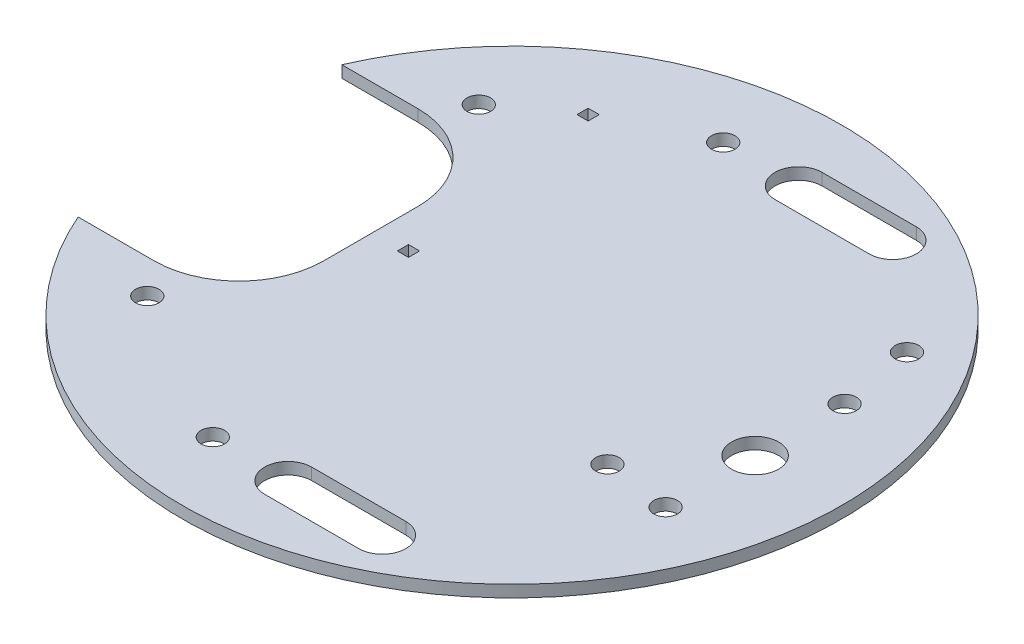
ISO-10303-21;
HEADER;
FILE_DESCRIPTION(('STEP AP214'),'2;1');
FILE_NAME('part.step','',(''),(''),'','','');
FILE_SCHEMA(('AUTOMOTIVE_DESIGN { 1 0 10303 214 1 1 1 1 }'));
ENDSEC;
DATA;
#1=APPLICATION_CONTEXT('core data for automotive mechanical design processes');
#2=APPLICATION_PROTOCOL_DEFINITION('international standard','automotive_design',2000,#1);
#3=PRODUCT_CONTEXT('',#1,'mechanical');
#4=PRODUCT('Part','Part','',(#3));
#5=PRODUCT_RELATED_PRODUCT_CATEGORY('part','',(#4));
#6=PRODUCT_DEFINITION_FORMATION('','',#4);
#7=PRODUCT_DEFINITION_CONTEXT('part definition',#1,'design');
#8=PRODUCT_DEFINITION('design','',#6,#7);
#9=PRODUCT_DEFINITION_SHAPE('','',#8);
#10=(LENGTH_UNIT() NAMED_UNIT(*) SI_UNIT(.MILLI.,.METRE.));
#11=(NAMED_UNIT(*) PLANE_ANGLE_UNIT() SI_UNIT($,.RADIAN.));
#12=(NAMED_UNIT(*) SI_UNIT($,.STERADIAN.) SOLID_ANGLE_UNIT());
#13=UNCERTAINTY_MEASURE_WITH_UNIT(LENGTH_MEASURE(1.E-05),#10,'distance_accuracy_value','');
#14=(GEOMETRIC_REPRESENTATION_CONTEXT(3) GLOBAL_UNCERTAINTY_ASSIGNED_CONTEXT((#13)) GLOBAL_UNIT_ASSIGNED_CONTEXT((#10,
#11,#12)) REPRESENTATION_CONTEXT('',''));
#15=CARTESIAN_POINT('',(0.,0.,0.));
#16=DIRECTION('',(0.,0.,1.));
#17=DIRECTION('',(1.,0.,0.));
#18=AXIS2_PLACEMENT_3D('',#15,#16,#17);
#19=CARTESIAN_POINT('',(0.,3.175,0.));
#20=DIRECTION('',(0.,-1.,0.));
#21=DIRECTION('',(0.,0.,-1.));
#22=AXIS2_PLACEMENT_3D('',#19,#20,#21);
#23=CYLINDRICAL_SURFACE('',#22,88.9);
#24=CARTESIAN_POINT('',(0.,3.175,0.));
#25=DIRECTION('',(0.,1.,0.));
#26=DIRECTION('',(0.,0.,1.));
#27=AXIS2_PLACEMENT_3D('',#24,#25,#26);
#28=CIRCLE('',#27,88.9);
#29=CARTESIAN_POINT('',(-81.4781958563148,3.175,35.56));
#30=VERTEX_POINT('',#29);
#31=CARTESIAN_POINT('',(-81.4781958563148,3.175,-35.56));
#32=VERTEX_POINT('',#31);
#33=EDGE_CURVE('E387',#30,#32,#28,.T.);
#34=ORIENTED_EDGE('',*,*,#33,.F.);
#35=DIRECTION('',(0.,-1.,0.));
#36=VECTOR('',#35,1.);
#37=CARTESIAN_POINT('',(-81.4781958563148,3.175,35.56));
#38=LINE('',#37,#36);
#39=CARTESIAN_POINT('',(-81.4781958563148,0.,35.56));
#40=VERTEX_POINT('',#39);
#41=EDGE_CURVE('E383',#30,#40,#38,.T.);
#42=ORIENTED_EDGE('',*,*,#41,.T.);
#43=CARTESIAN_POINT('',(0.,0.,0.));
#44=DIRECTION('',(0.,1.,0.));
#45=DIRECTION('',(0.,0.,1.));
#46=AXIS2_PLACEMENT_3D('',#43,#44,#45);
#47=CIRCLE('',#46,88.9);
#48=CARTESIAN_POINT('',(-81.4781958563148,0.,-35.56));
#49=VERTEX_POINT('',#48);
#50=EDGE_CURVE('E386',#40,#49,#47,.T.);
#51=ORIENTED_EDGE('',*,*,#50,.T.);
#52=DIRECTION('',(0.,-1.,0.));
#53=VECTOR('',#52,1.);
#54=CARTESIAN_POINT('',(-81.4781958563148,3.175,-35.56));
#55=LINE('',#54,#53);
#56=EDGE_CURVE('E378',#49,#32,#55,.F.);
#57=ORIENTED_EDGE('',*,*,#56,.T.);
#58=EDGE_LOOP('',(#34,#42,#51,#57));
#59=FACE_BOUND('',#58,.T.);
#60=ADVANCED_FACE('F34',(#59),#23,.T.);
#61=CARTESIAN_POINT('',(0.,3.175,0.));
#62=DIRECTION('',(0.,1.,0.));
#63=DIRECTION('',(0.,0.,1.));
#64=AXIS2_PLACEMENT_3D('',#61,#62,#63);
#65=PLANE('',#64);
#66=DIRECTION('',(1.,0.,0.));
#67=VECTOR('',#66,1.);
#68=CARTESIAN_POINT('',(0.,3.175,-62.4827214621127));
#69=LINE('',#68,#67);
#70=CARTESIAN_POINT('',(8.44233372588642,3.175,-62.4827214621127));
#71=VERTEX_POINT('',#70);
#72=CARTESIAN_POINT('',(33.8423337258864,3.175,-62.4827214621127));
#73=VERTEX_POINT('',#72);
#74=EDGE_CURVE('E49',#71,#73,#69,.T.);
#75=ORIENTED_EDGE('',*,*,#74,.F.);
#76=CARTESIAN_POINT('',(8.44233372588642,3.175,-68.8327214621127));
#77=DIRECTION('',(0.,1.,0.));
#78=DIRECTION('',(0.,0.,1.));
#79=AXIS2_PLACEMENT_3D('',#76,#77,#78);
#80=CIRCLE('',#79,6.34999999999999);
#81=CARTESIAN_POINT('',(8.44233372588642,3.175,-75.1827214621127));
#82=VERTEX_POINT('',#81);
#83=EDGE_CURVE('E203',#82,#71,#80,.T.);
#84=ORIENTED_EDGE('',*,*,#83,.F.);
#85=DIRECTION('',(1.,0.,0.));
#86=VECTOR('',#85,1.);
#87=CARTESIAN_POINT('',(0.,3.175,-75.1827214621127));
#88=LINE('',#87,#86);
#89=CARTESIAN_POINT('',(33.8423337258864,3.175,-75.1827214621127));
#90=VERTEX_POINT('',#89);
#91=EDGE_CURVE('E206',#82,#90,#88,.T.);
#92=ORIENTED_EDGE('',*,*,#91,.T.);
#93=CARTESIAN_POINT('',(33.8423337258864,3.175,-68.8327214621127));
#94=DIRECTION('',(0.,1.,0.));
#95=DIRECTION('',(0.,0.,1.));
#96=AXIS2_PLACEMENT_3D('',#93,#94,#95);
#97=CIRCLE('',#96,6.34999999999999);
#98=EDGE_CURVE('E212',#73,#90,#97,.T.);
#99=ORIENTED_EDGE('',*,*,#98,.F.);
#100=EDGE_LOOP('',(#75,#84,#92,#99));
#101=FACE_BOUND('',#100,.T.);
#102=CARTESIAN_POINT('',(65.5497185348647,3.175,0.));
#103=DIRECTION('',(0.,1.,0.));
#104=DIRECTION('',(0.,0.,1.));
#105=AXIS2_PLACEMENT_3D('',#102,#103,#104);
#106=CIRCLE('',#105,6.35);
#107=CARTESIAN_POINT('',(65.5497185348647,3.175,6.35));
#108=VERTEX_POINT('',#107);
#109=EDGE_CURVE('E225',#108,#108,#106,.T.);
#110=ORIENTED_EDGE('',*,*,#109,.F.);
#111=EDGE_LOOP('',(#110));
#112=FACE_BOUND('',#111,.T.);
#113=DIRECTION('',(1.,0.,0.));
#114=VECTOR('',#113,1.);
#115=CARTESIAN_POINT('',(0.,3.175,75.1827214621126));
#116=LINE('',#115,#114);
#117=CARTESIAN_POINT('',(8.44233372588644,3.175,75.1827214621126));
#118=VERTEX_POINT('',#117);
#119=CARTESIAN_POINT('',(33.8423337258864,3.175,75.1827214621126));
#120=VERTEX_POINT('',#119);
#121=EDGE_CURVE('E57',#118,#120,#116,.T.);
#122=ORIENTED_EDGE('',*,*,#121,.F.);
#123=CARTESIAN_POINT('',(8.44233372588644,3.175,68.8327214621126));
#124=DIRECTION('',(0.,1.,0.));
#125=DIRECTION('',(0.,0.,1.));
#126=AXIS2_PLACEMENT_3D('',#123,#124,#125);
#127=CIRCLE('',#126,6.34999999999999);
#128=CARTESIAN_POINT('',(8.44233372588644,3.175,62.4827214621126));
#129=VERTEX_POINT('',#128);
#130=EDGE_CURVE('E233',#129,#118,#127,.T.);
#131=ORIENTED_EDGE('',*,*,#130,.F.);
#132=DIRECTION('',(1.,0.,0.));
#133=VECTOR('',#132,1.);
#134=CARTESIAN_POINT('',(0.,3.175,62.4827214621126));
#135=LINE('',#134,#133);
#136=CARTESIAN_POINT('',(33.8423337258864,3.175,62.4827214621126));
#137=VERTEX_POINT('',#136);
#138=EDGE_CURVE('E247',#129,#137,#135,.T.);
#139=ORIENTED_EDGE('',*,*,#138,.T.);
#140=CARTESIAN_POINT('',(33.8423337258864,3.175,68.8327214621126));
#141=DIRECTION('',(0.,1.,0.));
#142=DIRECTION('',(0.,0.,1.));
#143=AXIS2_PLACEMENT_3D('',#140,#141,#142);
#144=CIRCLE('',#143,6.34999999999999);
#145=EDGE_CURVE('E244',#120,#137,#144,.T.);
#146=ORIENTED_EDGE('',*,*,#145,.F.);
#147=EDGE_LOOP('',(#122,#131,#139,#146));
#148=FACE_BOUND('',#147,.T.);
#149=DIRECTION('',(0.,0.,1.));
#150=VECTOR('',#149,1.);
#151=CARTESIAN_POINT('',(-38.1,3.175,0.));
#152=LINE('',#151,#150);
#153=CARTESIAN_POINT('',(-38.1,3.175,-58.62));
#154=VERTEX_POINT('',#153);
#155=CARTESIAN_POINT('',(-38.1,3.175,-55.62));
#156=VERTEX_POINT('',#155);
#157=EDGE_CURVE('E271',#154,#156,#152,.T.);
#158=ORIENTED_EDGE('',*,*,#157,.F.);
#159=DIRECTION('',(1.,0.,0.));
#160=VECTOR('',#159,1.);
#161=CARTESIAN_POINT('',(0.,3.175,-58.62));
#162=LINE('',#161,#160);
#163=CARTESIAN_POINT('',(-35.1,3.175,-58.62));
#164=VERTEX_POINT('',#163);
#165=EDGE_CURVE('E262',#154,#164,#162,.T.);
#166=ORIENTED_EDGE('',*,*,#165,.T.);
#167=DIRECTION('',(0.,0.,1.));
#168=VECTOR('',#167,1.);
#169=CARTESIAN_POINT('',(-35.0999999999999,3.175,0.));
#170=LINE('',#169,#168);
#171=CARTESIAN_POINT('',(-35.1,3.175,-55.62));
#172=VERTEX_POINT('',#171);
#173=EDGE_CURVE('E277',#164,#172,#170,.T.);
#174=ORIENTED_EDGE('',*,*,#173,.T.);
#175=DIRECTION('',(1.,0.,0.));
#176=VECTOR('',#175,1.);
#177=CARTESIAN_POINT('',(0.,3.175,-55.62));
#178=LINE('',#177,#176);
#179=EDGE_CURVE('E273',#156,#172,#178,.T.);
#180=ORIENTED_EDGE('',*,*,#179,.F.);
#181=EDGE_LOOP('',(#158,#166,#174,#180));
#182=FACE_BOUND('',#181,.T.);
#183=DIRECTION('',(0.,0.,1.));
#184=VECTOR('',#183,1.);
#185=CARTESIAN_POINT('',(-30.48,3.175,0.));
#186=LINE('',#185,#184);
#187=CARTESIAN_POINT('',(-30.48,3.175,-2.54000000000001));
#188=VERTEX_POINT('',#187);
#189=CARTESIAN_POINT('',(-30.48,3.175,0.459999999999989));
#190=VERTEX_POINT('',#189);
#191=EDGE_CURVE('E274',#188,#190,#186,.T.);
#192=ORIENTED_EDGE('',*,*,#191,.F.);
#193=DIRECTION('',(1.,0.,0.));
#194=VECTOR('',#193,1.);
#195=CARTESIAN_POINT('',(0.,3.175,-2.54000000000001));
#196=LINE('',#195,#194);
#197=CARTESIAN_POINT('',(-27.48,3.175,-2.54000000000001));
#198=VERTEX_POINT('',#197);
#199=EDGE_CURVE('E302',#188,#198,#196,.T.);
#200=ORIENTED_EDGE('',*,*,#199,.T.);
#201=DIRECTION('',(0.,0.,1.));
#202=VECTOR('',#201,1.);
#203=CARTESIAN_POINT('',(-27.48,3.175,0.));
#204=LINE('',#203,#202);
#205=CARTESIAN_POINT('',(-27.48,3.175,0.459999999999989));
#206=VERTEX_POINT('',#205);
#207=EDGE_CURVE('E305',#198,#206,#204,.T.);
#208=ORIENTED_EDGE('',*,*,#207,.T.);
#209=DIRECTION('',(1.,0.,0.));
#210=VECTOR('',#209,1.);
#211=CARTESIAN_POINT('',(0.,3.175,0.459999999999989));
#212=LINE('',#211,#210);
#213=EDGE_CURVE('E309',#190,#206,#212,.T.);
#214=ORIENTED_EDGE('',*,*,#213,.F.);
#215=EDGE_LOOP('',(#192,#200,#208,#214));
#216=FACE_BOUND('',#215,.T.);
#217=CARTESIAN_POINT('',(61.9,3.175,-44.62));
#218=DIRECTION('',(0.,1.,0.));
#219=DIRECTION('',(0.,0.,1.));
#220=AXIS2_PLACEMENT_3D('',#217,#218,#219);
#221=CIRCLE('',#220,3.175);
#222=CARTESIAN_POINT('',(61.9,3.175,-41.445));
#223=VERTEX_POINT('',#222);
#224=EDGE_CURVE('E301',#223,#223,#221,.T.);
#225=ORIENTED_EDGE('',*,*,#224,.F.);
#226=EDGE_LOOP('',(#225));
#227=FACE_BOUND('',#226,.T.);
#228=CARTESIAN_POINT('',(47.695,3.175,21.96));
#229=DIRECTION('',(0.,1.,0.));
#230=DIRECTION('',(0.,0.,1.));
#231=AXIS2_PLACEMENT_3D('',#228,#229,#230);
#232=CIRCLE('',#231,3.175);
#233=CARTESIAN_POINT('',(47.695,3.175,25.135));
#234=VERTEX_POINT('',#233);
#235=EDGE_CURVE('E327',#234,#234,#232,.T.);
#236=ORIENTED_EDGE('',*,*,#235,.F.);
#237=EDGE_LOOP('',(#236));
#238=FACE_BOUND('',#237,.T.);
#239=DIRECTION('',(1.,0.,0.));
#240=VECTOR('',#239,1.);
#241=CARTESIAN_POINT('',(-88.9,3.175,35.56));
#242=LINE('',#241,#240);
#243=CARTESIAN_POINT('',(-60.96,3.175,35.56));
#244=VERTEX_POINT('',#243);
#245=EDGE_CURVE('E364',#30,#244,#242,.T.);
#246=ORIENTED_EDGE('',*,*,#245,.F.);
#247=ORIENTED_EDGE('',*,*,#33,.T.);
#248=DIRECTION('',(-1.,0.,0.));
#249=VECTOR('',#248,1.);
#250=CARTESIAN_POINT('',(-38.1,3.175,-35.56));
#251=LINE('',#250,#249);
#252=CARTESIAN_POINT('',(-60.96,3.175,-35.56));
#253=VERTEX_POINT('',#252);
#254=EDGE_CURVE('E367',#253,#32,#251,.T.);
#255=ORIENTED_EDGE('',*,*,#254,.F.);
#256=CARTESIAN_POINT('',(-60.96,3.175,-12.7));
#257=DIRECTION('',(0.,1.,0.));
#258=DIRECTION('',(0.,0.,1.));
#259=AXIS2_PLACEMENT_3D('',#256,#257,#258);
#260=CIRCLE('',#259,22.86);
#261=CARTESIAN_POINT('',(-38.1,3.175,-12.7));
#262=VERTEX_POINT('',#261);
#263=EDGE_CURVE('E42',#253,#262,#260,.F.);
#264=ORIENTED_EDGE('',*,*,#263,.T.);
#265=DIRECTION('',(0.,0.,-1.));
#266=VECTOR('',#265,1.);
#267=CARTESIAN_POINT('',(-38.1,3.175,35.56));
#268=LINE('',#267,#266);
#269=CARTESIAN_POINT('',(-38.1,3.175,12.7));
#270=VERTEX_POINT('',#269);
#271=EDGE_CURVE('E363',#270,#262,#268,.T.);
#272=ORIENTED_EDGE('',*,*,#271,.F.);
#273=CARTESIAN_POINT('',(-60.96,3.175,12.7));
#274=DIRECTION('',(0.,1.,0.));
#275=DIRECTION('',(0.,0.,1.));
#276=AXIS2_PLACEMENT_3D('',#273,#274,#275);
#277=CIRCLE('',#276,22.86);
#278=EDGE_CURVE('E405',#270,#244,#277,.F.);
#279=ORIENTED_EDGE('',*,*,#278,.T.);
#280=EDGE_LOOP('',(#246,#247,#255,#264,#272,#279));
#281=FACE_BOUND('',#280,.T.);
#282=CARTESIAN_POINT('',(-53.672052260751,3.175,44.7027214621126));
#283=DIRECTION('',(0.,1.,0.));
#284=DIRECTION('',(0.,0.,1.));
#285=AXIS2_PLACEMENT_3D('',#282,#283,#284);
#286=CIRCLE('',#285,3.175);
#287=CARTESIAN_POINT('',(-53.672052260751,3.175,47.8777214621126));
#288=VERTEX_POINT('',#287);
#289=EDGE_CURVE('E357',#288,#288,#286,.T.);
#290=ORIENTED_EDGE('',*,*,#289,.F.);
#291=EDGE_LOOP('',(#290));
#292=FACE_BOUND('',#291,.T.);
#293=CARTESIAN_POINT('',(-11.8776662741139,3.175,68.8327214621126));
#294=DIRECTION('',(0.,1.,0.));
#295=DIRECTION('',(0.,0.,1.));
#296=AXIS2_PLACEMENT_3D('',#293,#294,#295);
#297=CIRCLE('',#296,3.17499999999999);
#298=CARTESIAN_POINT('',(-11.8776662741139,3.175,72.0077214621126));
#299=VERTEX_POINT('',#298);
#300=EDGE_CURVE('E351',#299,#299,#297,.T.);
#301=ORIENTED_EDGE('',*,*,#300,.F.);
#302=EDGE_LOOP('',(#301));
#303=FACE_BOUND('',#302,.T.);
#304=CARTESIAN_POINT('',(65.5497185348648,3.175,24.13));
#305=DIRECTION('',(0.,1.,0.));
#306=DIRECTION('',(0.,0.,1.));
#307=AXIS2_PLACEMENT_3D('',#304,#305,#306);
#308=CIRCLE('',#307,3.175);
#309=CARTESIAN_POINT('',(65.5497185348648,3.175,27.305));
#310=VERTEX_POINT('',#309);
#311=EDGE_CURVE('E345',#310,#310,#308,.T.);
#312=ORIENTED_EDGE('',*,*,#311,.F.);
#313=EDGE_LOOP('',(#312));
#314=FACE_BOUND('',#313,.T.);
#315=CARTESIAN_POINT('',(65.5497185348648,3.175,-24.13));
#316=DIRECTION('',(0.,1.,0.));
#317=DIRECTION('',(0.,0.,1.));
#318=AXIS2_PLACEMENT_3D('',#315,#316,#317);
#319=CIRCLE('',#318,3.175);
#320=CARTESIAN_POINT('',(65.5497185348648,3.175,-20.955));
#321=VERTEX_POINT('',#320);
#322=EDGE_CURVE('E339',#321,#321,#319,.T.);
#323=ORIENTED_EDGE('',*,*,#322,.F.);
#324=EDGE_LOOP('',(#323));
#325=FACE_BOUND('',#324,.T.);
#326=CARTESIAN_POINT('',(-11.877666274114,3.175,-68.8327214621127));
#327=DIRECTION('',(0.,1.,0.));
#328=DIRECTION('',(0.,0.,1.));
#329=AXIS2_PLACEMENT_3D('',#326,#327,#328);
#330=CIRCLE('',#329,3.175);
#331=CARTESIAN_POINT('',(-11.877666274114,3.175,-65.6577214621127));
#332=VERTEX_POINT('',#331);
#333=EDGE_CURVE('E332',#332,#332,#330,.T.);
#334=ORIENTED_EDGE('',*,*,#333,.F.);
#335=EDGE_LOOP('',(#334));
#336=FACE_BOUND('',#335,.T.);
#337=CARTESIAN_POINT('',(-53.672052260751,3.175,-44.7027214621127));
#338=DIRECTION('',(0.,1.,0.));
#339=DIRECTION('',(0.,0.,1.));
#340=AXIS2_PLACEMENT_3D('',#337,#338,#339);
#341=CIRCLE('',#340,3.17499999999999);
#342=CARTESIAN_POINT('',(-53.672052260751,3.175,-41.5277214621127));
#343=VERTEX_POINT('',#342);
#344=EDGE_CURVE('E335',#343,#343,#341,.T.);
#345=ORIENTED_EDGE('',*,*,#344,.F.);
#346=EDGE_LOOP('',(#345));
#347=FACE_BOUND('',#346,.T.);
#348=ADVANCED_FACE('F412',(#101,#112,#148,#182,#216,#227,#238,#281,#292,#303,#314,#325,#336,
#347),#65,.T.);
#349=CARTESIAN_POINT('',(0.,0.,0.));
#350=DIRECTION('',(0.,1.,0.));
#351=DIRECTION('',(0.,0.,1.));
#352=AXIS2_PLACEMENT_3D('',#349,#350,#351);
#353=PLANE('',#352);
#354=CARTESIAN_POINT('',(8.44233372588642,0.,-68.8327214621127));
#355=DIRECTION('',(0.,1.,0.));
#356=DIRECTION('',(0.,0.,1.));
#357=AXIS2_PLACEMENT_3D('',#354,#355,#356);
#358=CIRCLE('',#357,6.34999999999999);
#359=CARTESIAN_POINT('',(8.44233372588642,0.,-75.1827214621127));
#360=VERTEX_POINT('',#359);
#361=CARTESIAN_POINT('',(8.44233372588642,0.,-62.4827214621127));
#362=VERTEX_POINT('',#361);
#363=EDGE_CURVE('E190',#360,#362,#358,.T.);
#364=ORIENTED_EDGE('',*,*,#363,.T.);
#365=DIRECTION('',(1.,0.,0.));
#366=VECTOR('',#365,1.);
#367=CARTESIAN_POINT('',(0.,0.,-62.4827214621127));
#368=LINE('',#367,#366);
#369=CARTESIAN_POINT('',(33.8423337258864,0.,-62.4827214621127));
#370=VERTEX_POINT('',#369);
#371=EDGE_CURVE('E184',#362,#370,#368,.T.);
#372=ORIENTED_EDGE('',*,*,#371,.T.);
#373=CARTESIAN_POINT('',(33.8423337258864,0.,-68.8327214621127));
#374=DIRECTION('',(0.,1.,0.));
#375=DIRECTION('',(0.,0.,1.));
#376=AXIS2_PLACEMENT_3D('',#373,#374,#375);
#377=CIRCLE('',#376,6.34999999999999);
#378=CARTESIAN_POINT('',(33.8423337258864,0.,-75.1827214621127));
#379=VERTEX_POINT('',#378);
#380=EDGE_CURVE('E193',#370,#379,#377,.T.);
#381=ORIENTED_EDGE('',*,*,#380,.T.);
#382=DIRECTION('',(1.,0.,0.));
#383=VECTOR('',#382,1.);
#384=CARTESIAN_POINT('',(0.,0.,-75.1827214621127));
#385=LINE('',#384,#383);
#386=EDGE_CURVE('E198',#360,#379,#385,.T.);
#387=ORIENTED_EDGE('',*,*,#386,.F.);
#388=EDGE_LOOP('',(#364,#372,#381,#387));
#389=FACE_BOUND('',#388,.T.);
#390=CARTESIAN_POINT('',(65.5497185348647,0.,0.));
#391=DIRECTION('',(0.,1.,0.));
#392=DIRECTION('',(0.,0.,1.));
#393=AXIS2_PLACEMENT_3D('',#390,#391,#392);
#394=CIRCLE('',#393,6.35);
#395=CARTESIAN_POINT('',(65.5497185348647,0.,6.35));
#396=VERTEX_POINT('',#395);
#397=EDGE_CURVE('E213',#396,#396,#394,.T.);
#398=ORIENTED_EDGE('',*,*,#397,.T.);
#399=EDGE_LOOP('',(#398));
#400=FACE_BOUND('',#399,.T.);
#401=CARTESIAN_POINT('',(8.44233372588644,0.,68.8327214621126));
#402=DIRECTION('',(0.,1.,0.));
#403=DIRECTION('',(0.,0.,1.));
#404=AXIS2_PLACEMENT_3D('',#401,#402,#403);
#405=CIRCLE('',#404,6.34999999999999);
#406=CARTESIAN_POINT('',(8.44233372588644,0.,62.4827214621126));
#407=VERTEX_POINT('',#406);
#408=CARTESIAN_POINT('',(8.44233372588644,0.,75.1827214621126));
#409=VERTEX_POINT('',#408);
#410=EDGE_CURVE('E239',#407,#409,#405,.T.);
#411=ORIENTED_EDGE('',*,*,#410,.T.);
#412=DIRECTION('',(1.,0.,0.));
#413=VECTOR('',#412,1.);
#414=CARTESIAN_POINT('',(0.,0.,75.1827214621126));
#415=LINE('',#414,#413);
#416=CARTESIAN_POINT('',(33.8423337258864,0.,75.1827214621126));
#417=VERTEX_POINT('',#416);
#418=EDGE_CURVE('E229',#409,#417,#415,.T.);
#419=ORIENTED_EDGE('',*,*,#418,.T.);
#420=CARTESIAN_POINT('',(33.8423337258864,0.,68.8327214621126));
#421=DIRECTION('',(0.,1.,0.));
#422=DIRECTION('',(0.,0.,1.));
#423=AXIS2_PLACEMENT_3D('',#420,#421,#422);
#424=CIRCLE('',#423,6.34999999999999);
#425=CARTESIAN_POINT('',(33.8423337258864,0.,62.4827214621126));
#426=VERTEX_POINT('',#425);
#427=EDGE_CURVE('E232',#417,#426,#424,.T.);
#428=ORIENTED_EDGE('',*,*,#427,.T.);
#429=DIRECTION('',(1.,0.,0.));
#430=VECTOR('',#429,1.);
#431=CARTESIAN_POINT('',(0.,0.,62.4827214621126));
#432=LINE('',#431,#430);
#433=EDGE_CURVE('E236',#407,#426,#432,.T.);
#434=ORIENTED_EDGE('',*,*,#433,.F.);
#435=EDGE_LOOP('',(#411,#419,#428,#434));
#436=FACE_BOUND('',#435,.T.);
#437=DIRECTION('',(1.,0.,0.));
#438=VECTOR('',#437,1.);
#439=CARTESIAN_POINT('',(0.,0.,-58.62));
#440=LINE('',#439,#438);
#441=CARTESIAN_POINT('',(-38.1,0.,-58.62));
#442=VERTEX_POINT('',#441);
#443=CARTESIAN_POINT('',(-35.1,0.,-58.62));
#444=VERTEX_POINT('',#443);
#445=EDGE_CURVE('E268',#442,#444,#440,.T.);
#446=ORIENTED_EDGE('',*,*,#445,.F.);
#447=DIRECTION('',(0.,0.,1.));
#448=VECTOR('',#447,1.);
#449=CARTESIAN_POINT('',(-38.1,0.,0.));
#450=LINE('',#449,#448);
#451=CARTESIAN_POINT('',(-38.1,0.,-55.62));
#452=VERTEX_POINT('',#451);
#453=EDGE_CURVE('E258',#442,#452,#450,.T.);
#454=ORIENTED_EDGE('',*,*,#453,.T.);
#455=DIRECTION('',(1.,0.,0.));
#456=VECTOR('',#455,1.);
#457=CARTESIAN_POINT('',(0.,0.,-55.62));
#458=LINE('',#457,#456);
#459=CARTESIAN_POINT('',(-35.1,0.,-55.62));
#460=VERTEX_POINT('',#459);
#461=EDGE_CURVE('E261',#452,#460,#458,.T.);
#462=ORIENTED_EDGE('',*,*,#461,.T.);
#463=DIRECTION('',(0.,0.,1.));
#464=VECTOR('',#463,1.);
#465=CARTESIAN_POINT('',(-35.0999999999999,0.,0.));
#466=LINE('',#465,#464);
#467=EDGE_CURVE('E265',#444,#460,#466,.T.);
#468=ORIENTED_EDGE('',*,*,#467,.F.);
#469=EDGE_LOOP('',(#446,#454,#462,#468));
#470=FACE_BOUND('',#469,.T.);
#471=DIRECTION('',(1.,0.,0.));
#472=VECTOR('',#471,1.);
#473=CARTESIAN_POINT('',(0.,0.,-2.54000000000001));
#474=LINE('',#473,#472);
#475=CARTESIAN_POINT('',(-30.48,0.,-2.54000000000001));
#476=VERTEX_POINT('',#475);
#477=CARTESIAN_POINT('',(-27.48,0.,-2.54000000000001));
#478=VERTEX_POINT('',#477);
#479=EDGE_CURVE('E294',#476,#478,#474,.T.);
#480=ORIENTED_EDGE('',*,*,#479,.F.);
#481=DIRECTION('',(0.,0.,1.));
#482=VECTOR('',#481,1.);
#483=CARTESIAN_POINT('',(-30.48,0.,0.));
#484=LINE('',#483,#482);
#485=CARTESIAN_POINT('',(-30.48,0.,0.459999999999989));
#486=VERTEX_POINT('',#485);
#487=EDGE_CURVE('E306',#476,#486,#484,.T.);
#488=ORIENTED_EDGE('',*,*,#487,.T.);
#489=DIRECTION('',(1.,0.,0.));
#490=VECTOR('',#489,1.);
#491=CARTESIAN_POINT('',(0.,0.,0.459999999999989));
#492=LINE('',#491,#490);
#493=CARTESIAN_POINT('',(-27.48,0.,0.459999999999989));
#494=VERTEX_POINT('',#493);
#495=EDGE_CURVE('E317',#486,#494,#492,.T.);
#496=ORIENTED_EDGE('',*,*,#495,.T.);
#497=DIRECTION('',(0.,0.,1.));
#498=VECTOR('',#497,1.);
#499=CARTESIAN_POINT('',(-27.48,0.,0.));
#500=LINE('',#499,#498);
#501=EDGE_CURVE('E314',#478,#494,#500,.T.);
#502=ORIENTED_EDGE('',*,*,#501,.F.);
#503=EDGE_LOOP('',(#480,#488,#496,#502));
#504=FACE_BOUND('',#503,.T.);
#505=CARTESIAN_POINT('',(61.9,0.,-44.62));
#506=DIRECTION('',(0.,1.,0.));
#507=DIRECTION('',(0.,0.,1.));
#508=AXIS2_PLACEMENT_3D('',#505,#506,#507);
#509=CIRCLE('',#508,3.175);
#510=CARTESIAN_POINT('',(61.9,0.,-41.445));
#511=VERTEX_POINT('',#510);
#512=EDGE_CURVE('E324',#511,#511,#509,.T.);
#513=ORIENTED_EDGE('',*,*,#512,.T.);
#514=EDGE_LOOP('',(#513));
#515=FACE_BOUND('',#514,.T.);
#516=CARTESIAN_POINT('',(47.695,0.,21.96));
#517=DIRECTION('',(0.,1.,0.));
#518=DIRECTION('',(0.,0.,1.));
#519=AXIS2_PLACEMENT_3D('',#516,#517,#518);
#520=CIRCLE('',#519,3.175);
#521=CARTESIAN_POINT('',(47.695,0.,25.135));
#522=VERTEX_POINT('',#521);
#523=EDGE_CURVE('E219',#522,#522,#520,.T.);
#524=ORIENTED_EDGE('',*,*,#523,.T.);
#525=EDGE_LOOP('',(#524));
#526=FACE_BOUND('',#525,.T.);
#527=CARTESIAN_POINT('',(-53.672052260751,0.,44.7027214621126));
#528=DIRECTION('',(0.,1.,0.));
#529=DIRECTION('',(0.,0.,1.));
#530=AXIS2_PLACEMENT_3D('',#527,#528,#529);
#531=CIRCLE('',#530,3.175);
#532=CARTESIAN_POINT('',(-53.672052260751,0.,47.8777214621126));
#533=VERTEX_POINT('',#532);
#534=EDGE_CURVE('E360',#533,#533,#531,.T.);
#535=ORIENTED_EDGE('',*,*,#534,.T.);
#536=EDGE_LOOP('',(#535));
#537=FACE_BOUND('',#536,.T.);
#538=CARTESIAN_POINT('',(-11.8776662741139,0.,68.8327214621126));
#539=DIRECTION('',(0.,1.,0.));
#540=DIRECTION('',(0.,0.,1.));
#541=AXIS2_PLACEMENT_3D('',#538,#539,#540);
#542=CIRCLE('',#541,3.17499999999999);
#543=CARTESIAN_POINT('',(-11.8776662741139,0.,72.0077214621126));
#544=VERTEX_POINT('',#543);
#545=EDGE_CURVE('E354',#544,#544,#542,.T.);
#546=ORIENTED_EDGE('',*,*,#545,.T.);
#547=EDGE_LOOP('',(#546));
#548=FACE_BOUND('',#547,.T.);
#549=CARTESIAN_POINT('',(65.5497185348648,0.,24.13));
#550=DIRECTION('',(0.,1.,0.));
#551=DIRECTION('',(0.,0.,1.));
#552=AXIS2_PLACEMENT_3D('',#549,#550,#551);
#553=CIRCLE('',#552,3.175);
#554=CARTESIAN_POINT('',(65.5497185348648,0.,27.305));
#555=VERTEX_POINT('',#554);
#556=EDGE_CURVE('E348',#555,#555,#553,.T.);
#557=ORIENTED_EDGE('',*,*,#556,.T.);
#558=EDGE_LOOP('',(#557));
#559=FACE_BOUND('',#558,.T.);
#560=CARTESIAN_POINT('',(65.5497185348648,0.,-24.13));
#561=DIRECTION('',(0.,1.,0.));
#562=DIRECTION('',(0.,0.,1.));
#563=AXIS2_PLACEMENT_3D('',#560,#561,#562);
#564=CIRCLE('',#563,3.175);
#565=CARTESIAN_POINT('',(65.5497185348648,0.,-20.955));
#566=VERTEX_POINT('',#565);
#567=EDGE_CURVE('E342',#566,#566,#564,.T.);
#568=ORIENTED_EDGE('',*,*,#567,.T.);
#569=EDGE_LOOP('',(#568));
#570=FACE_BOUND('',#569,.T.);
#571=CARTESIAN_POINT('',(-11.877666274114,0.,-68.8327214621127));
#572=DIRECTION('',(0.,1.,0.));
#573=DIRECTION('',(0.,0.,1.));
#574=AXIS2_PLACEMENT_3D('',#571,#572,#573);
#575=CIRCLE('',#574,3.175);
#576=CARTESIAN_POINT('',(-11.877666274114,0.,-65.6577214621127));
#577=VERTEX_POINT('',#576);
#578=EDGE_CURVE('E336',#577,#577,#575,.T.);
#579=ORIENTED_EDGE('',*,*,#578,.T.);
#580=EDGE_LOOP('',(#579));
#581=FACE_BOUND('',#580,.T.);
#582=CARTESIAN_POINT('',(-53.672052260751,0.,-44.7027214621127));
#583=DIRECTION('',(0.,1.,0.));
#584=DIRECTION('',(0.,0.,1.));
#585=AXIS2_PLACEMENT_3D('',#582,#583,#584);
#586=CIRCLE('',#585,3.17499999999999);
#587=CARTESIAN_POINT('',(-53.672052260751,0.,-41.5277214621127));
#588=VERTEX_POINT('',#587);
#589=EDGE_CURVE('E375',#588,#588,#586,.T.);
#590=ORIENTED_EDGE('',*,*,#589,.T.);
#591=EDGE_LOOP('',(#590));
#592=FACE_BOUND('',#591,.T.);
#593=ORIENTED_EDGE('',*,*,#50,.F.);
#594=DIRECTION('',(1.,0.,0.));
#595=VECTOR('',#594,1.);
#596=CARTESIAN_POINT('',(0.,0.,35.56));
#597=LINE('',#596,#595);
#598=CARTESIAN_POINT('',(-60.96,0.,35.56));
#599=VERTEX_POINT('',#598);
#600=EDGE_CURVE('E390',#40,#599,#597,.T.);
#601=ORIENTED_EDGE('',*,*,#600,.T.);
#602=CARTESIAN_POINT('',(-60.96,0.,12.7));
#603=DIRECTION('',(0.,1.,0.));
#604=DIRECTION('',(0.,0.,1.));
#605=AXIS2_PLACEMENT_3D('',#602,#603,#604);
#606=CIRCLE('',#605,22.86);
#607=CARTESIAN_POINT('',(-38.1,0.,12.7));
#608=VERTEX_POINT('',#607);
#609=EDGE_CURVE('E407',#599,#608,#606,.T.);
#610=ORIENTED_EDGE('',*,*,#609,.T.);
#611=DIRECTION('',(0.,0.,-1.));
#612=VECTOR('',#611,1.);
#613=CARTESIAN_POINT('',(-38.1,0.,35.56));
#614=LINE('',#613,#612);
#615=CARTESIAN_POINT('',(-38.1,0.,-12.7));
#616=VERTEX_POINT('',#615);
#617=EDGE_CURVE('E368',#608,#616,#614,.T.);
#618=ORIENTED_EDGE('',*,*,#617,.T.);
#619=CARTESIAN_POINT('',(-60.96,0.,-12.7));
#620=DIRECTION('',(0.,1.,0.));
#621=DIRECTION('',(0.,0.,1.));
#622=AXIS2_PLACEMENT_3D('',#619,#620,#621);
#623=CIRCLE('',#622,22.86);
#624=CARTESIAN_POINT('',(-60.96,0.,-35.56));
#625=VERTEX_POINT('',#624);
#626=EDGE_CURVE('E12',#616,#625,#623,.T.);
#627=ORIENTED_EDGE('',*,*,#626,.T.);
#628=DIRECTION('',(-1.,0.,0.));
#629=VECTOR('',#628,1.);
#630=CARTESIAN_POINT('',(-38.1,0.,-35.56));
#631=LINE('',#630,#629);
#632=EDGE_CURVE('E284',#625,#49,#631,.T.);
#633=ORIENTED_EDGE('',*,*,#632,.T.);
#634=EDGE_LOOP('',(#593,#601,#610,#618,#627,#633));
#635=FACE_BOUND('',#634,.T.);
#636=ADVANCED_FACE('F200',(#389,#400,#436,#470,#504,#515,#526,#537,#548,#559,#570,#581,#592,
#635),#353,.F.);
#637=CARTESIAN_POINT('',(-53.672052260751,0.,-44.7027214621127));
#638=DIRECTION('',(0.,1.,0.));
#639=DIRECTION('',(0.,0.,1.));
#640=AXIS2_PLACEMENT_3D('',#637,#638,#639);
#641=CYLINDRICAL_SURFACE('',#640,3.17499999999999);
#642=ORIENTED_EDGE('',*,*,#589,.F.);
#643=EDGE_LOOP('',(#642));
#644=FACE_BOUND('',#643,.T.);
#645=ORIENTED_EDGE('',*,*,#344,.T.);
#646=EDGE_LOOP('',(#645));
#647=FACE_BOUND('',#646,.T.);
#648=ADVANCED_FACE('F506',(#644,#647),#641,.F.);
#649=CARTESIAN_POINT('',(-11.877666274114,0.,-68.8327214621127));
#650=DIRECTION('',(0.,1.,0.));
#651=DIRECTION('',(0.,0.,1.));
#652=AXIS2_PLACEMENT_3D('',#649,#650,#651);
#653=CYLINDRICAL_SURFACE('',#652,3.175);
#654=ORIENTED_EDGE('',*,*,#578,.F.);
#655=EDGE_LOOP('',(#654));
#656=FACE_BOUND('',#655,.T.);
#657=ORIENTED_EDGE('',*,*,#333,.T.);
#658=EDGE_LOOP('',(#657));
#659=FACE_BOUND('',#658,.T.);
#660=ADVANCED_FACE('F502',(#656,#659),#653,.F.);
#661=CARTESIAN_POINT('',(65.5497185348648,0.,-24.13));
#662=DIRECTION('',(0.,1.,0.));
#663=DIRECTION('',(0.,0.,1.));
#664=AXIS2_PLACEMENT_3D('',#661,#662,#663);
#665=CYLINDRICAL_SURFACE('',#664,3.175);
#666=ORIENTED_EDGE('',*,*,#567,.F.);
#667=EDGE_LOOP('',(#666));
#668=FACE_BOUND('',#667,.T.);
#669=ORIENTED_EDGE('',*,*,#322,.T.);
#670=EDGE_LOOP('',(#669));
#671=FACE_BOUND('',#670,.T.);
#672=ADVANCED_FACE('F505',(#668,#671),#665,.F.);
#673=CARTESIAN_POINT('',(65.5497185348648,0.,24.13));
#674=DIRECTION('',(0.,1.,0.));
#675=DIRECTION('',(0.,0.,1.));
#676=AXIS2_PLACEMENT_3D('',#673,#674,#675);
#677=CYLINDRICAL_SURFACE('',#676,3.175);
#678=ORIENTED_EDGE('',*,*,#556,.F.);
#679=EDGE_LOOP('',(#678));
#680=FACE_BOUND('',#679,.T.);
#681=ORIENTED_EDGE('',*,*,#311,.T.);
#682=EDGE_LOOP('',(#681));
#683=FACE_BOUND('',#682,.T.);
#684=ADVANCED_FACE('F510',(#680,#683),#677,.F.);
#685=CARTESIAN_POINT('',(-11.8776662741139,0.,68.8327214621126));
#686=DIRECTION('',(0.,1.,0.));
#687=DIRECTION('',(0.,0.,1.));
#688=AXIS2_PLACEMENT_3D('',#685,#686,#687);
#689=CYLINDRICAL_SURFACE('',#688,3.17499999999999);
#690=ORIENTED_EDGE('',*,*,#545,.F.);
#691=EDGE_LOOP('',(#690));
#692=FACE_BOUND('',#691,.T.);
#693=ORIENTED_EDGE('',*,*,#300,.T.);
#694=EDGE_LOOP('',(#693));
#695=FACE_BOUND('',#694,.T.);
#696=ADVANCED_FACE('F444',(#692,#695),#689,.F.);
#697=CARTESIAN_POINT('',(-53.672052260751,0.,44.7027214621126));
#698=DIRECTION('',(0.,1.,0.));
#699=DIRECTION('',(0.,0.,1.));
#700=AXIS2_PLACEMENT_3D('',#697,#698,#699);
#701=CYLINDRICAL_SURFACE('',#700,3.175);
#702=ORIENTED_EDGE('',*,*,#534,.F.);
#703=EDGE_LOOP('',(#702));
#704=FACE_BOUND('',#703,.T.);
#705=ORIENTED_EDGE('',*,*,#289,.T.);
#706=EDGE_LOOP('',(#705));
#707=FACE_BOUND('',#706,.T.);
#708=ADVANCED_FACE('F437',(#704,#707),#701,.F.);
#709=CARTESIAN_POINT('',(-88.9,0.,35.56));
#710=DIRECTION('',(0.,0.,1.));
#711=DIRECTION('',(1.,0.,0.));
#712=AXIS2_PLACEMENT_3D('',#709,#710,#711);
#713=PLANE('',#712);
#714=ORIENTED_EDGE('',*,*,#245,.T.);
#715=DIRECTION('',(0.,1.,0.));
#716=VECTOR('',#715,1.);
#717=CARTESIAN_POINT('',(-60.96,0.,35.56));
#718=LINE('',#717,#716);
#719=EDGE_CURVE('E400',#244,#599,#718,.F.);
#720=ORIENTED_EDGE('',*,*,#719,.T.);
#721=ORIENTED_EDGE('',*,*,#600,.F.);
#722=ORIENTED_EDGE('',*,*,#41,.F.);
#723=EDGE_LOOP('',(#714,#720,#721,#722));
#724=FACE_BOUND('',#723,.T.);
#725=ADVANCED_FACE('F435',(#724),#713,.F.);
#726=CARTESIAN_POINT('',(-38.1,0.,-35.56));
#727=DIRECTION('',(0.,0.,-1.));
#728=DIRECTION('',(-1.,0.,0.));
#729=AXIS2_PLACEMENT_3D('',#726,#727,#728);
#730=PLANE('',#729);
#731=ORIENTED_EDGE('',*,*,#632,.F.);
#732=DIRECTION('',(0.,1.,0.));
#733=VECTOR('',#732,1.);
#734=CARTESIAN_POINT('',(-60.96,3.175,-35.56));
#735=LINE('',#734,#733);
#736=EDGE_CURVE('E402',#625,#253,#735,.T.);
#737=ORIENTED_EDGE('',*,*,#736,.T.);
#738=ORIENTED_EDGE('',*,*,#254,.T.);
#739=ORIENTED_EDGE('',*,*,#56,.F.);
#740=EDGE_LOOP('',(#731,#737,#738,#739));
#741=FACE_BOUND('',#740,.T.);
#742=ADVANCED_FACE('F427',(#741),#730,.F.);
#743=CARTESIAN_POINT('',(-38.1,0.,35.56));
#744=DIRECTION('',(1.,0.,0.));
#745=DIRECTION('',(0.,0.,-1.));
#746=AXIS2_PLACEMENT_3D('',#743,#744,#745);
#747=PLANE('',#746);
#748=ORIENTED_EDGE('',*,*,#617,.F.);
#749=DIRECTION('',(0.,1.,0.));
#750=VECTOR('',#749,1.);
#751=CARTESIAN_POINT('',(-38.1,3.175,12.7));
#752=LINE('',#751,#750);
#753=EDGE_CURVE('E397',#608,#270,#752,.T.);
#754=ORIENTED_EDGE('',*,*,#753,.T.);
#755=ORIENTED_EDGE('',*,*,#271,.T.);
#756=DIRECTION('',(0.,1.,0.));
#757=VECTOR('',#756,1.);
#758=CARTESIAN_POINT('',(-38.1,0.,-12.7));
#759=LINE('',#758,#757);
#760=EDGE_CURVE('E395',#262,#616,#759,.F.);
#761=ORIENTED_EDGE('',*,*,#760,.T.);
#762=EDGE_LOOP('',(#748,#754,#755,#761));
#763=FACE_BOUND('',#762,.T.);
#764=ADVANCED_FACE('F419',(#763),#747,.F.);
#765=CARTESIAN_POINT('',(47.695,0.,21.96));
#766=DIRECTION('',(0.,1.,0.));
#767=DIRECTION('',(0.,0.,1.));
#768=AXIS2_PLACEMENT_3D('',#765,#766,#767);
#769=CYLINDRICAL_SURFACE('',#768,3.175);
#770=ORIENTED_EDGE('',*,*,#523,.F.);
#771=EDGE_LOOP('',(#770));
#772=FACE_BOUND('',#771,.T.);
#773=ORIENTED_EDGE('',*,*,#235,.T.);
#774=EDGE_LOOP('',(#773));
#775=FACE_BOUND('',#774,.T.);
#776=ADVANCED_FACE('F497',(#772,#775),#769,.F.);
#777=CARTESIAN_POINT('',(61.9,0.,-44.62));
#778=DIRECTION('',(0.,1.,0.));
#779=DIRECTION('',(0.,0.,1.));
#780=AXIS2_PLACEMENT_3D('',#777,#778,#779);
#781=CYLINDRICAL_SURFACE('',#780,3.175);
#782=ORIENTED_EDGE('',*,*,#512,.F.);
#783=EDGE_LOOP('',(#782));
#784=FACE_BOUND('',#783,.T.);
#785=ORIENTED_EDGE('',*,*,#224,.T.);
#786=EDGE_LOOP('',(#785));
#787=FACE_BOUND('',#786,.T.);
#788=ADVANCED_FACE('F483',(#784,#787),#781,.F.);
#789=CARTESIAN_POINT('',(-30.48,0.,0.));
#790=DIRECTION('',(-1.,0.,0.));
#791=DIRECTION('',(0.,0.,1.));
#792=AXIS2_PLACEMENT_3D('',#789,#790,#791);
#793=PLANE('',#792);
#794=ORIENTED_EDGE('',*,*,#191,.T.);
#795=DIRECTION('',(0.,1.,0.));
#796=VECTOR('',#795,1.);
#797=CARTESIAN_POINT('',(-30.48,0.,0.459999999999989));
#798=LINE('',#797,#796);
#799=EDGE_CURVE('E291',#486,#190,#798,.T.);
#800=ORIENTED_EDGE('',*,*,#799,.F.);
#801=ORIENTED_EDGE('',*,*,#487,.F.);
#802=DIRECTION('',(0.,1.,0.));
#803=VECTOR('',#802,1.);
#804=CARTESIAN_POINT('',(-30.48,0.,-2.54000000000001));
#805=LINE('',#804,#803);
#806=EDGE_CURVE('E299',#476,#188,#805,.T.);
#807=ORIENTED_EDGE('',*,*,#806,.T.);
#808=EDGE_LOOP('',(#794,#800,#801,#807));
#809=FACE_BOUND('',#808,.T.);
#810=ADVANCED_FACE('F479',(#809),#793,.F.);
#811=CARTESIAN_POINT('',(0.,0.,-2.54000000000001));
#812=DIRECTION('',(0.,0.,1.));
#813=DIRECTION('',(1.,0.,0.));
#814=AXIS2_PLACEMENT_3D('',#811,#812,#813);
#815=PLANE('',#814);
#816=ORIENTED_EDGE('',*,*,#199,.F.);
#817=ORIENTED_EDGE('',*,*,#806,.F.);
#818=ORIENTED_EDGE('',*,*,#479,.T.);
#819=DIRECTION('',(0.,1.,0.));
#820=VECTOR('',#819,1.);
#821=CARTESIAN_POINT('',(-27.48,0.,-2.54000000000001));
#822=LINE('',#821,#820);
#823=EDGE_CURVE('E297',#478,#198,#822,.T.);
#824=ORIENTED_EDGE('',*,*,#823,.T.);
#825=EDGE_LOOP('',(#816,#817,#818,#824));
#826=FACE_BOUND('',#825,.T.);
#827=ADVANCED_FACE('F482',(#826),#815,.T.);
#828=CARTESIAN_POINT('',(-27.48,0.,0.));
#829=DIRECTION('',(-1.,0.,0.));
#830=DIRECTION('',(0.,0.,1.));
#831=AXIS2_PLACEMENT_3D('',#828,#829,#830);
#832=PLANE('',#831);
#833=ORIENTED_EDGE('',*,*,#207,.F.);
#834=ORIENTED_EDGE('',*,*,#823,.F.);
#835=ORIENTED_EDGE('',*,*,#501,.T.);
#836=DIRECTION('',(0.,1.,0.));
#837=VECTOR('',#836,1.);
#838=CARTESIAN_POINT('',(-27.48,0.,0.459999999999989));
#839=LINE('',#838,#837);
#840=EDGE_CURVE('E295',#494,#206,#839,.T.);
#841=ORIENTED_EDGE('',*,*,#840,.T.);
#842=EDGE_LOOP('',(#833,#834,#835,#841));
#843=FACE_BOUND('',#842,.T.);
#844=ADVANCED_FACE('F487',(#843),#832,.T.);
#845=CARTESIAN_POINT('',(0.,0.,0.459999999999989));
#846=DIRECTION('',(0.,0.,1.));
#847=DIRECTION('',(1.,0.,0.));
#848=AXIS2_PLACEMENT_3D('',#845,#846,#847);
#849=PLANE('',#848);
#850=ORIENTED_EDGE('',*,*,#213,.T.);
#851=ORIENTED_EDGE('',*,*,#840,.F.);
#852=ORIENTED_EDGE('',*,*,#495,.F.);
#853=ORIENTED_EDGE('',*,*,#799,.T.);
#854=EDGE_LOOP('',(#850,#851,#852,#853));
#855=FACE_BOUND('',#854,.T.);
#856=ADVANCED_FACE('F477',(#855),#849,.F.);
#857=CARTESIAN_POINT('',(-38.1,0.,0.));
#858=DIRECTION('',(-1.,0.,0.));
#859=DIRECTION('',(0.,0.,1.));
#860=AXIS2_PLACEMENT_3D('',#857,#858,#859);
#861=PLANE('',#860);
#862=ORIENTED_EDGE('',*,*,#157,.T.);
#863=DIRECTION('',(0.,1.,0.));
#864=VECTOR('',#863,1.);
#865=CARTESIAN_POINT('',(-38.1,0.,-55.62));
#866=LINE('',#865,#864);
#867=EDGE_CURVE('E270',#452,#156,#866,.T.);
#868=ORIENTED_EDGE('',*,*,#867,.F.);
#869=ORIENTED_EDGE('',*,*,#453,.F.);
#870=DIRECTION('',(0.,1.,0.));
#871=VECTOR('',#870,1.);
#872=CARTESIAN_POINT('',(-38.1,0.,-58.62));
#873=LINE('',#872,#871);
#874=EDGE_CURVE('E282',#442,#154,#873,.T.);
#875=ORIENTED_EDGE('',*,*,#874,.T.);
#876=EDGE_LOOP('',(#862,#868,#869,#875));
#877=FACE_BOUND('',#876,.T.);
#878=ADVANCED_FACE('F474',(#877),#861,.F.);
#879=CARTESIAN_POINT('',(0.,0.,-58.62));
#880=DIRECTION('',(0.,0.,1.));
#881=DIRECTION('',(1.,0.,0.));
#882=AXIS2_PLACEMENT_3D('',#879,#880,#881);
#883=PLANE('',#882);
#884=ORIENTED_EDGE('',*,*,#165,.F.);
#885=ORIENTED_EDGE('',*,*,#874,.F.);
#886=ORIENTED_EDGE('',*,*,#445,.T.);
#887=DIRECTION('',(0.,1.,0.));
#888=VECTOR('',#887,1.);
#889=CARTESIAN_POINT('',(-35.1,0.,-58.62));
#890=LINE('',#889,#888);
#891=EDGE_CURVE('E285',#444,#164,#890,.T.);
#892=ORIENTED_EDGE('',*,*,#891,.T.);
#893=EDGE_LOOP('',(#884,#885,#886,#892));
#894=FACE_BOUND('',#893,.T.);
#895=ADVANCED_FACE('F469',(#894),#883,.T.);
#896=CARTESIAN_POINT('',(-35.0999999999999,0.,0.));
#897=DIRECTION('',(-1.,0.,0.));
#898=DIRECTION('',(0.,0.,1.));
#899=AXIS2_PLACEMENT_3D('',#896,#897,#898);
#900=PLANE('',#899);
#901=ORIENTED_EDGE('',*,*,#173,.F.);
#902=ORIENTED_EDGE('',*,*,#891,.F.);
#903=ORIENTED_EDGE('',*,*,#467,.T.);
#904=DIRECTION('',(0.,1.,0.));
#905=VECTOR('',#904,1.);
#906=CARTESIAN_POINT('',(-35.1,0.,-55.62));
#907=LINE('',#906,#905);
#908=EDGE_CURVE('E287',#460,#172,#907,.T.);
#909=ORIENTED_EDGE('',*,*,#908,.T.);
#910=EDGE_LOOP('',(#901,#902,#903,#909));
#911=FACE_BOUND('',#910,.T.);
#912=ADVANCED_FACE('F463',(#911),#900,.T.);
#913=CARTESIAN_POINT('',(0.,0.,-55.62));
#914=DIRECTION('',(0.,0.,1.));
#915=DIRECTION('',(1.,0.,0.));
#916=AXIS2_PLACEMENT_3D('',#913,#914,#915);
#917=PLANE('',#916);
#918=ORIENTED_EDGE('',*,*,#179,.T.);
#919=ORIENTED_EDGE('',*,*,#908,.F.);
#920=ORIENTED_EDGE('',*,*,#461,.F.);
#921=ORIENTED_EDGE('',*,*,#867,.T.);
#922=EDGE_LOOP('',(#918,#919,#920,#921));
#923=FACE_BOUND('',#922,.T.);
#924=ADVANCED_FACE('F457',(#923),#917,.F.);
#925=CARTESIAN_POINT('',(-60.96,0.,12.7));
#926=DIRECTION('',(0.,-1.,0.));
#927=DIRECTION('',(0.,0.,-1.));
#928=AXIS2_PLACEMENT_3D('',#925,#926,#927);
#929=CYLINDRICAL_SURFACE('',#928,22.86);
#930=ORIENTED_EDGE('',*,*,#609,.F.);
#931=ORIENTED_EDGE('',*,*,#719,.F.);
#932=ORIENTED_EDGE('',*,*,#278,.F.);
#933=ORIENTED_EDGE('',*,*,#753,.F.);
#934=EDGE_LOOP('',(#930,#931,#932,#933));
#935=FACE_BOUND('',#934,.T.);
#936=ADVANCED_FACE('F434',(#935),#929,.F.);
#937=CARTESIAN_POINT('',(-60.96,0.,-12.7));
#938=DIRECTION('',(0.,-1.,0.));
#939=DIRECTION('',(0.,0.,-1.));
#940=AXIS2_PLACEMENT_3D('',#937,#938,#939);
#941=CYLINDRICAL_SURFACE('',#940,22.86);
#942=ORIENTED_EDGE('',*,*,#626,.F.);
#943=ORIENTED_EDGE('',*,*,#760,.F.);
#944=ORIENTED_EDGE('',*,*,#263,.F.);
#945=ORIENTED_EDGE('',*,*,#736,.F.);
#946=EDGE_LOOP('',(#942,#943,#944,#945));
#947=FACE_BOUND('',#946,.T.);
#948=ADVANCED_FACE('F36',(#947),#941,.F.);
#949=CARTESIAN_POINT('',(0.,0.,75.1827214621126));
#950=DIRECTION('',(0.,0.,1.));
#951=DIRECTION('',(1.,0.,0.));
#952=AXIS2_PLACEMENT_3D('',#949,#950,#951);
#953=PLANE('',#952);
#954=ORIENTED_EDGE('',*,*,#121,.T.);
#955=DIRECTION('',(0.,1.,0.));
#956=VECTOR('',#955,1.);
#957=CARTESIAN_POINT('',(33.8423337258864,0.,75.1827214621126));
#958=LINE('',#957,#956);
#959=EDGE_CURVE('E242',#417,#120,#958,.T.);
#960=ORIENTED_EDGE('',*,*,#959,.F.);
#961=ORIENTED_EDGE('',*,*,#418,.F.);
#962=DIRECTION('',(0.,1.,0.));
#963=VECTOR('',#962,1.);
#964=CARTESIAN_POINT('',(8.44233372588644,0.,75.1827214621126));
#965=LINE('',#964,#963);
#966=EDGE_CURVE('E228',#409,#118,#965,.T.);
#967=ORIENTED_EDGE('',*,*,#966,.T.);
#968=EDGE_LOOP('',(#954,#960,#961,#967));
#969=FACE_BOUND('',#968,.T.);
#970=ADVANCED_FACE('F462',(#969),#953,.F.);
#971=CARTESIAN_POINT('',(8.44233372588644,0.,68.8327214621126));
#972=DIRECTION('',(0.,1.,0.));
#973=DIRECTION('',(0.,0.,1.));
#974=AXIS2_PLACEMENT_3D('',#971,#972,#973);
#975=CYLINDRICAL_SURFACE('',#974,6.34999999999999);
#976=ORIENTED_EDGE('',*,*,#130,.T.);
#977=ORIENTED_EDGE('',*,*,#966,.F.);
#978=ORIENTED_EDGE('',*,*,#410,.F.);
#979=DIRECTION('',(0.,1.,0.));
#980=VECTOR('',#979,1.);
#981=CARTESIAN_POINT('',(8.44233372588644,0.,62.4827214621126));
#982=LINE('',#981,#980);
#983=EDGE_CURVE('E253',#407,#129,#982,.T.);
#984=ORIENTED_EDGE('',*,*,#983,.T.);
#985=EDGE_LOOP('',(#976,#977,#978,#984));
#986=FACE_BOUND('',#985,.T.);
#987=ADVANCED_FACE('F670',(#986),#975,.F.);
#988=CARTESIAN_POINT('',(0.,0.,62.4827214621126));
#989=DIRECTION('',(0.,0.,1.));
#990=DIRECTION('',(1.,0.,0.));
#991=AXIS2_PLACEMENT_3D('',#988,#989,#990);
#992=PLANE('',#991);
#993=ORIENTED_EDGE('',*,*,#138,.F.);
#994=ORIENTED_EDGE('',*,*,#983,.F.);
#995=ORIENTED_EDGE('',*,*,#433,.T.);
#996=DIRECTION('',(0.,1.,0.));
#997=VECTOR('',#996,1.);
#998=CARTESIAN_POINT('',(33.8423337258864,0.,62.4827214621126));
#999=LINE('',#998,#997);
#1000=EDGE_CURVE('E255',#426,#137,#999,.T.);
#1001=ORIENTED_EDGE('',*,*,#1000,.T.);
#1002=EDGE_LOOP('',(#993,#994,#995,#1001));
#1003=FACE_BOUND('',#1002,.T.);
#1004=ADVANCED_FACE('F676',(#1003),#992,.T.);
#1005=CARTESIAN_POINT('',(33.8423337258864,0.,68.8327214621126));
#1006=DIRECTION('',(0.,1.,0.));
#1007=DIRECTION('',(0.,0.,1.));
#1008=AXIS2_PLACEMENT_3D('',#1005,#1006,#1007);
#1009=CYLINDRICAL_SURFACE('',#1008,6.34999999999999);
#1010=ORIENTED_EDGE('',*,*,#145,.T.);
#1011=ORIENTED_EDGE('',*,*,#1000,.F.);
#1012=ORIENTED_EDGE('',*,*,#427,.F.);
#1013=ORIENTED_EDGE('',*,*,#959,.T.);
#1014=EDGE_LOOP('',(#1010,#1011,#1012,#1013));
#1015=FACE_BOUND('',#1014,.T.);
#1016=ADVANCED_FACE('F684',(#1015),#1009,.F.);
#1017=CARTESIAN_POINT('',(65.5497185348647,0.,0.));
#1018=DIRECTION('',(0.,1.,0.));
#1019=DIRECTION('',(0.,0.,1.));
#1020=AXIS2_PLACEMENT_3D('',#1017,#1018,#1019);
#1021=CYLINDRICAL_SURFACE('',#1020,6.35);
#1022=ORIENTED_EDGE('',*,*,#397,.F.);
#1023=EDGE_LOOP('',(#1022));
#1024=FACE_BOUND('',#1023,.T.);
#1025=ORIENTED_EDGE('',*,*,#109,.T.);
#1026=EDGE_LOOP('',(#1025));
#1027=FACE_BOUND('',#1026,.T.);
#1028=ADVANCED_FACE('F692',(#1024,#1027),#1021,.F.);
#1029=CARTESIAN_POINT('',(0.,0.,-62.4827214621127));
#1030=DIRECTION('',(0.,0.,1.));
#1031=DIRECTION('',(1.,0.,0.));
#1032=AXIS2_PLACEMENT_3D('',#1029,#1030,#1031);
#1033=PLANE('',#1032);
#1034=ORIENTED_EDGE('',*,*,#74,.T.);
#1035=DIRECTION('',(0.,1.,0.));
#1036=VECTOR('',#1035,1.);
#1037=CARTESIAN_POINT('',(33.8423337258864,0.,-62.4827214621127));
#1038=LINE('',#1037,#1036);
#1039=EDGE_CURVE('E180',#370,#73,#1038,.T.);
#1040=ORIENTED_EDGE('',*,*,#1039,.F.);
#1041=ORIENTED_EDGE('',*,*,#371,.F.);
#1042=DIRECTION('',(0.,1.,0.));
#1043=VECTOR('',#1042,1.);
#1044=CARTESIAN_POINT('',(8.44233372588642,0.,-62.4827214621127));
#1045=LINE('',#1044,#1043);
#1046=EDGE_CURVE('E217',#362,#71,#1045,.T.);
#1047=ORIENTED_EDGE('',*,*,#1046,.T.);
#1048=EDGE_LOOP('',(#1034,#1040,#1041,#1047));
#1049=FACE_BOUND('',#1048,.T.);
#1050=ADVANCED_FACE('F182',(#1049),#1033,.F.);
#1051=CARTESIAN_POINT('',(8.44233372588642,0.,-68.8327214621127));
#1052=DIRECTION('',(0.,1.,0.));
#1053=DIRECTION('',(0.,0.,1.));
#1054=AXIS2_PLACEMENT_3D('',#1051,#1052,#1053);
#1055=CYLINDRICAL_SURFACE('',#1054,6.34999999999999);
#1056=ORIENTED_EDGE('',*,*,#83,.T.);
#1057=ORIENTED_EDGE('',*,*,#1046,.F.);
#1058=ORIENTED_EDGE('',*,*,#363,.F.);
#1059=DIRECTION('',(0.,1.,0.));
#1060=VECTOR('',#1059,1.);
#1061=CARTESIAN_POINT('',(8.44233372588642,0.,-75.1827214621127));
#1062=LINE('',#1061,#1060);
#1063=EDGE_CURVE('E220',#360,#82,#1062,.T.);
#1064=ORIENTED_EDGE('',*,*,#1063,.T.);
#1065=EDGE_LOOP('',(#1056,#1057,#1058,#1064));
#1066=FACE_BOUND('',#1065,.T.);
#1067=ADVANCED_FACE('F707',(#1066),#1055,.F.);
#1068=CARTESIAN_POINT('',(0.,0.,-75.1827214621127));
#1069=DIRECTION('',(0.,0.,1.));
#1070=DIRECTION('',(1.,0.,0.));
#1071=AXIS2_PLACEMENT_3D('',#1068,#1069,#1070);
#1072=PLANE('',#1071);
#1073=ORIENTED_EDGE('',*,*,#91,.F.);
#1074=ORIENTED_EDGE('',*,*,#1063,.F.);
#1075=ORIENTED_EDGE('',*,*,#386,.T.);
#1076=DIRECTION('',(0.,1.,0.));
#1077=VECTOR('',#1076,1.);
#1078=CARTESIAN_POINT('',(33.8423337258864,0.,-75.1827214621127));
#1079=LINE('',#1078,#1077);
#1080=EDGE_CURVE('E189',#379,#90,#1079,.T.);
#1081=ORIENTED_EDGE('',*,*,#1080,.T.);
#1082=EDGE_LOOP('',(#1073,#1074,#1075,#1081));
#1083=FACE_BOUND('',#1082,.T.);
#1084=ADVANCED_FACE('F714',(#1083),#1072,.T.);
#1085=CARTESIAN_POINT('',(33.8423337258864,0.,-68.8327214621127));
#1086=DIRECTION('',(0.,1.,0.));
#1087=DIRECTION('',(0.,0.,1.));
#1088=AXIS2_PLACEMENT_3D('',#1085,#1086,#1087);
#1089=CYLINDRICAL_SURFACE('',#1088,6.34999999999999);
#1090=ORIENTED_EDGE('',*,*,#98,.T.);
#1091=ORIENTED_EDGE('',*,*,#1080,.F.);
#1092=ORIENTED_EDGE('',*,*,#380,.F.);
#1093=ORIENTED_EDGE('',*,*,#1039,.T.);
#1094=EDGE_LOOP('',(#1090,#1091,#1092,#1093));
#1095=FACE_BOUND('',#1094,.T.);
#1096=ADVANCED_FACE('F194',(#1095),#1089,.F.);
#1097=CLOSED_SHELL('',(#60,#348,#636,#648,#660,#672,#684,#696,#708,#725,#742,#764,#776,#788,
#810,#827,#844,#856,#878,#895,#912,#924,#936,#948,#970,#987,#1004,#1016,#1028,#1050,#1067,#1084,#1096));
#1098=MANIFOLD_SOLID_BREP('B2',#1097);
#1099=ADVANCED_BREP_SHAPE_REPRESENTATION('',(#18,#1098),#14);
#1100=SHAPE_DEFINITION_REPRESENTATION(#9,#1099);
ENDSEC;
END-ISO-10303-21;
